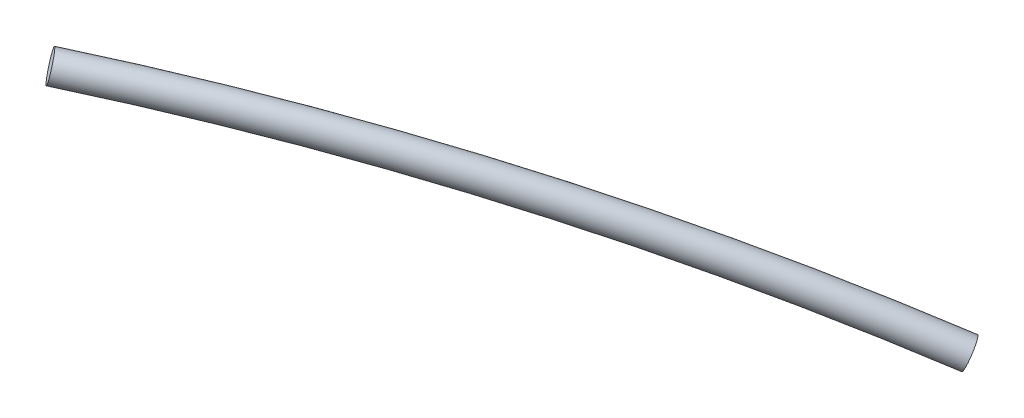
ISO-10303-21;
HEADER;
FILE_DESCRIPTION(('STEP AP214'),'2;1');
FILE_NAME('part.step','',(''),(''),'','','');
FILE_SCHEMA(('AUTOMOTIVE_DESIGN { 1 0 10303 214 1 1 1 1 }'));
ENDSEC;
DATA;
#1=APPLICATION_CONTEXT('core data for automotive mechanical design processes');
#2=APPLICATION_PROTOCOL_DEFINITION('international standard','automotive_design',2000,#1);
#3=PRODUCT_CONTEXT('',#1,'mechanical');
#4=PRODUCT('Part','Part','',(#3));
#5=PRODUCT_RELATED_PRODUCT_CATEGORY('part','',(#4));
#6=PRODUCT_DEFINITION_FORMATION('','',#4);
#7=PRODUCT_DEFINITION_CONTEXT('part definition',#1,'design');
#8=PRODUCT_DEFINITION('design','',#6,#7);
#9=PRODUCT_DEFINITION_SHAPE('','',#8);
#10=(LENGTH_UNIT() NAMED_UNIT(*) SI_UNIT(.MILLI.,.METRE.));
#11=(NAMED_UNIT(*) PLANE_ANGLE_UNIT() SI_UNIT($,.RADIAN.));
#12=(NAMED_UNIT(*) SI_UNIT($,.STERADIAN.) SOLID_ANGLE_UNIT());
#13=UNCERTAINTY_MEASURE_WITH_UNIT(LENGTH_MEASURE(1.E-05),#10,'distance_accuracy_value','');
#14=(GEOMETRIC_REPRESENTATION_CONTEXT(3) GLOBAL_UNCERTAINTY_ASSIGNED_CONTEXT((#13)) GLOBAL_UNIT_ASSIGNED_CONTEXT((#10,
#11,#12)) REPRESENTATION_CONTEXT('',''));
#15=CARTESIAN_POINT('',(0.,0.,0.));
#16=DIRECTION('',(0.,0.,1.));
#17=DIRECTION('',(1.,0.,0.));
#18=AXIS2_PLACEMENT_3D('',#15,#16,#17);
#19=CARTESIAN_POINT('',(3690.04104896918,-6838.62594898389,-9389.05407607556));
#20=DIRECTION('',(0.67600325972179,0.392041522336793,0.623957560743808));
#21=DIRECTION('',(0.678253427786098,0.,-0.734828066758754));
#22=AXIS2_PLACEMENT_3D('',#19,#20,#21);
#23=TOROIDAL_SURFACE('',#22,12164.3930939053,50.8000000000006);
#24=CARTESIAN_POINT('',(3963.23843508128,3323.26733401426,-16069.9033810838));
#25=DIRECTION('',(0.736556308914883,-0.38528346185096,-0.55591497355425));
#26=DIRECTION('',(-0.610236540628361,-0.0240606932924929,-0.791853804385769));
#27=AXIS2_PLACEMENT_3D('',#24,#25,#26);
#28=CIRCLE('',#27,50.8000000000006);
#29=CARTESIAN_POINT('',(3964.37934092898,3365.70464878955,-16097.8034285481));
#30=VERTEX_POINT('',#29);
#31=EDGE_CURVE('E10',#30,#30,#28,.T.);
#32=CARTESIAN_POINT('',(2173.75283558178,4052.98483968963,-14589.6447949308));
#33=DIRECTION('',(0.726279587854554,-0.211232633110375,-0.654139690719862));
#34=DIRECTION('',(-0.669240557698007,0.,-0.743045810116752));
#35=AXIS2_PLACEMENT_3D('',#32,#33,#34);
#36=CIRCLE('',#35,50.8000000000006);
#37=CARTESIAN_POINT('',(2167.42062972116,4098.46954441706,-14611.3631006842));
#38=VERTEX_POINT('',#37);
#39=EDGE_CURVE('E41',#38,#38,#36,.T.);
#40=CARTESIAN_POINT('',(3690.04104896918,-6838.62594898389,-9389.05407607556));
#41=DIRECTION('',(0.67600325972179,0.392041522336793,0.623957560743808));
#42=DIRECTION('',(0.678253427786098,0.,-0.734828066758754));
#43=AXIS2_PLACEMENT_3D('',#40,#41,#42);
#44=CIRCLE('',#43,12215.1930939053);
#45=EDGE_CURVE('',#30,#38,#44,.T.);
#46=ORIENTED_EDGE('',*,*,#31,.F.);
#47=ORIENTED_EDGE('',*,*,#39,.T.);
#48=ORIENTED_EDGE('',*,*,#45,.T.);
#49=ORIENTED_EDGE('',*,*,#45,.F.);
#50=EDGE_LOOP('',(#46,#48,#47,#49));
#51=FACE_BOUND('',#50,.T.);
#52=ADVANCED_FACE('F35',(#51),#23,.T.);
#53=CARTESIAN_POINT('',(3963.23843508128,3323.26733401426,-16069.9033810838));
#54=DIRECTION('',(0.736556308914883,-0.38528346185096,-0.55591497355425));
#55=DIRECTION('',(-0.610236540628361,-0.0240606932924929,-0.791853804385769));
#56=AXIS2_PLACEMENT_3D('',#53,#54,#55);
#57=PLANE('',#56);
#58=ORIENTED_EDGE('',*,*,#31,.T.);
#59=EDGE_LOOP('',(#58));
#60=FACE_BOUND('',#59,.T.);
#61=ADVANCED_FACE('F50',(#60),#57,.T.);
#62=CARTESIAN_POINT('',(2173.75283558178,4052.98483968963,-14589.6447949308));
#63=DIRECTION('',(0.726279587854554,-0.211232633110375,-0.654139690719862));
#64=DIRECTION('',(-0.669240557698007,0.,-0.743045810116752));
#65=AXIS2_PLACEMENT_3D('',#62,#63,#64);
#66=PLANE('',#65);
#67=ORIENTED_EDGE('',*,*,#39,.F.);
#68=EDGE_LOOP('',(#67));
#69=FACE_BOUND('',#68,.T.);
#70=ADVANCED_FACE('F48',(#69),#66,.F.);
#71=CLOSED_SHELL('',(#52,#61,#70));
#72=MANIFOLD_SOLID_BREP('B2',#71);
#73=ADVANCED_BREP_SHAPE_REPRESENTATION('',(#18,#72),#14);
#74=SHAPE_DEFINITION_REPRESENTATION(#9,#73);
ENDSEC;
END-ISO-10303-21;
